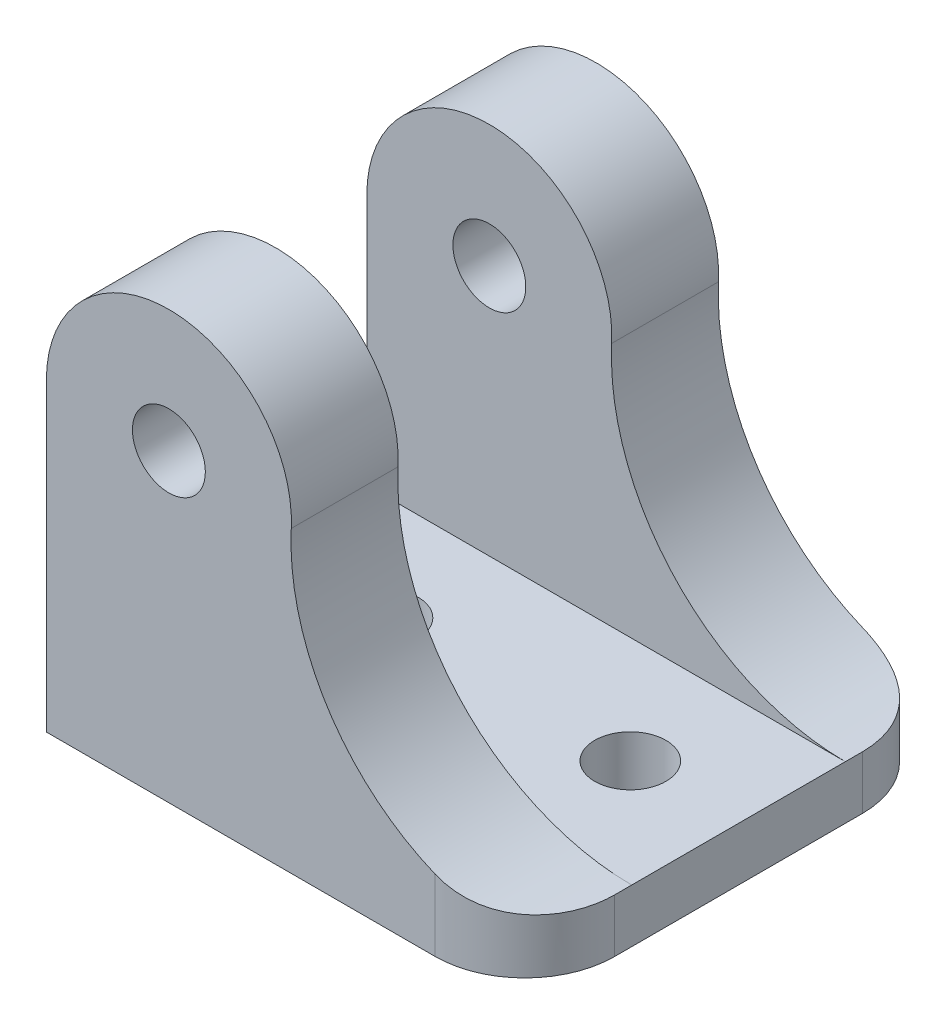
ISO-10303-21;
HEADER;
FILE_DESCRIPTION(('STEP AP214'),'2;1');
FILE_NAME('part.step','',(''),(''),'','','');
FILE_SCHEMA(('AUTOMOTIVE_DESIGN { 1 0 10303 214 1 1 1 1 }'));
ENDSEC;
DATA;
#1=APPLICATION_CONTEXT('core data for automotive mechanical design processes');
#2=APPLICATION_PROTOCOL_DEFINITION('international standard','automotive_design',2000,#1);
#3=PRODUCT_CONTEXT('',#1,'mechanical');
#4=PRODUCT('Part','Part','',(#3));
#5=PRODUCT_RELATED_PRODUCT_CATEGORY('part','',(#4));
#6=PRODUCT_DEFINITION_FORMATION('','',#4);
#7=PRODUCT_DEFINITION_CONTEXT('part definition',#1,'design');
#8=PRODUCT_DEFINITION('design','',#6,#7);
#9=PRODUCT_DEFINITION_SHAPE('','',#8);
#10=(LENGTH_UNIT() NAMED_UNIT(*) SI_UNIT(.MILLI.,.METRE.));
#11=(NAMED_UNIT(*) PLANE_ANGLE_UNIT() SI_UNIT($,.RADIAN.));
#12=(NAMED_UNIT(*) SI_UNIT($,.STERADIAN.) SOLID_ANGLE_UNIT());
#13=UNCERTAINTY_MEASURE_WITH_UNIT(LENGTH_MEASURE(1.E-05),#10,'distance_accuracy_value','');
#14=(GEOMETRIC_REPRESENTATION_CONTEXT(3) GLOBAL_UNCERTAINTY_ASSIGNED_CONTEXT((#13)) GLOBAL_UNIT_ASSIGNED_CONTEXT((#10,
#11,#12)) REPRESENTATION_CONTEXT('',''));
#15=CARTESIAN_POINT('',(0.,0.,0.));
#16=DIRECTION('',(0.,0.,1.));
#17=DIRECTION('',(1.,0.,0.));
#18=AXIS2_PLACEMENT_3D('',#15,#16,#17);
#19=CARTESIAN_POINT('',(-21.336,4.7625,19.05));
#20=DIRECTION('',(1.,0.,0.));
#21=DIRECTION('',(0.,0.,-1.));
#22=AXIS2_PLACEMENT_3D('',#19,#20,#21);
#23=PLANE('',#22);
#24=DIRECTION('',(0.,0.,1.));
#25=VECTOR('',#24,1.);
#26=CARTESIAN_POINT('',(-21.336,0.,19.05));
#27=LINE('',#26,#25);
#28=CARTESIAN_POINT('',(-21.336,0.,-19.05));
#29=VERTEX_POINT('',#28);
#30=CARTESIAN_POINT('',(-21.336,0.,19.05));
#31=VERTEX_POINT('',#30);
#32=EDGE_CURVE('E192',#29,#31,#27,.T.);
#33=ORIENTED_EDGE('',*,*,#32,.T.);
#34=DIRECTION('',(0.,-1.,0.));
#35=VECTOR('',#34,1.);
#36=CARTESIAN_POINT('',(-21.336,4.7625,19.05));
#37=LINE('',#36,#35);
#38=CARTESIAN_POINT('',(-21.336,27.178,19.05));
#39=VERTEX_POINT('',#38);
#40=EDGE_CURVE('E207',#39,#31,#37,.T.);
#41=ORIENTED_EDGE('',*,*,#40,.F.);
#42=DIRECTION('',(0.,0.,1.));
#43=VECTOR('',#42,1.);
#44=CARTESIAN_POINT('',(-21.336,27.178,9.525));
#45=LINE('',#44,#43);
#46=CARTESIAN_POINT('',(-21.336,27.178,9.525));
#47=VERTEX_POINT('',#46);
#48=EDGE_CURVE('E189',#47,#39,#45,.T.);
#49=ORIENTED_EDGE('',*,*,#48,.F.);
#50=DIRECTION('',(0.,-1.,0.));
#51=VECTOR('',#50,1.);
#52=CARTESIAN_POINT('',(-21.336,4.7625,9.525));
#53=LINE('',#52,#51);
#54=CARTESIAN_POINT('',(-21.336,4.7625,9.525));
#55=VERTEX_POINT('',#54);
#56=EDGE_CURVE('E128',#47,#55,#53,.T.);
#57=ORIENTED_EDGE('',*,*,#56,.T.);
#58=DIRECTION('',(0.,0.,1.));
#59=VECTOR('',#58,1.);
#60=CARTESIAN_POINT('',(-21.336,4.7625,19.05));
#61=LINE('',#60,#59);
#62=CARTESIAN_POINT('',(-21.336,4.7625,-9.525));
#63=VERTEX_POINT('',#62);
#64=EDGE_CURVE('E121',#63,#55,#61,.T.);
#65=ORIENTED_EDGE('',*,*,#64,.F.);
#66=DIRECTION('',(0.,-1.,0.));
#67=VECTOR('',#66,1.);
#68=CARTESIAN_POINT('',(-21.336,4.7625,-9.525));
#69=LINE('',#68,#67);
#70=CARTESIAN_POINT('',(-21.336,27.178,-9.525));
#71=VERTEX_POINT('',#70);
#72=EDGE_CURVE('E126',#71,#63,#69,.T.);
#73=ORIENTED_EDGE('',*,*,#72,.F.);
#74=DIRECTION('',(0.,0.,-1.));
#75=VECTOR('',#74,1.);
#76=CARTESIAN_POINT('',(-21.336,27.178,-9.525));
#77=LINE('',#76,#75);
#78=CARTESIAN_POINT('',(-21.336,27.178,-19.05));
#79=VERTEX_POINT('',#78);
#80=EDGE_CURVE('E155',#71,#79,#77,.T.);
#81=ORIENTED_EDGE('',*,*,#80,.T.);
#82=DIRECTION('',(0.,-1.,0.));
#83=VECTOR('',#82,1.);
#84=CARTESIAN_POINT('',(-21.336,4.7625,-19.05));
#85=LINE('',#84,#83);
#86=EDGE_CURVE('E197',#79,#29,#85,.T.);
#87=ORIENTED_EDGE('',*,*,#86,.T.);
#88=EDGE_LOOP('',(#33,#41,#49,#57,#65,#73,#81,#87));
#89=FACE_BOUND('',#88,.T.);
#90=ADVANCED_FACE('F35',(#89),#23,.F.);
#91=CARTESIAN_POINT('',(21.336,4.7625,19.05));
#92=DIRECTION('',(0.,0.,-1.));
#93=DIRECTION('',(-1.,0.,0.));
#94=AXIS2_PLACEMENT_3D('',#91,#92,#93);
#95=PLANE('',#94);
#96=DIRECTION('',(1.,0.,0.));
#97=VECTOR('',#96,1.);
#98=CARTESIAN_POINT('',(21.336,0.,19.05));
#99=LINE('',#98,#97);
#100=CARTESIAN_POINT('',(13.336,0.,19.05));
#101=VERTEX_POINT('',#100);
#102=EDGE_CURVE('E199',#31,#101,#99,.T.);
#103=ORIENTED_EDGE('',*,*,#102,.T.);
#104=DIRECTION('',(0.,-1.,0.));
#105=VECTOR('',#104,1.);
#106=CARTESIAN_POINT('',(13.336,4.7625,19.05));
#107=LINE('',#106,#105);
#108=CARTESIAN_POINT('',(13.336,6.35755295261252,19.05));
#109=VERTEX_POINT('',#108);
#110=EDGE_CURVE('E48',#101,#109,#107,.F.);
#111=ORIENTED_EDGE('',*,*,#110,.T.);
#112=CARTESIAN_POINT('',(21.336,25.6220563591309,19.05));
#113=DIRECTION('',(0.,0.,-1.));
#114=DIRECTION('',(1.,0.,0.));
#115=AXIS2_PLACEMENT_3D('',#112,#113,#114);
#116=CIRCLE('',#115,20.8595563591309);
#117=CARTESIAN_POINT('',(0.501451895639545,26.6431816143503,19.05));
#118=VERTEX_POINT('',#117);
#119=EDGE_CURVE('E172',#109,#118,#116,.T.);
#120=ORIENTED_EDGE('',*,*,#119,.T.);
#121=CARTESIAN_POINT('',(-10.4107249660736,27.178,19.05));
#122=DIRECTION('',(0.,0.,1.));
#123=DIRECTION('',(-1.,0.,0.));
#124=AXIS2_PLACEMENT_3D('',#121,#122,#123);
#125=CIRCLE('',#124,10.9252750339264);
#126=EDGE_CURVE('E178',#118,#39,#125,.T.);
#127=ORIENTED_EDGE('',*,*,#126,.T.);
#128=ORIENTED_EDGE('',*,*,#40,.T.);
#129=EDGE_LOOP('',(#103,#111,#120,#127,#128));
#130=FACE_BOUND('',#129,.T.);
#131=CARTESIAN_POINT('',(-10.4107249660736,27.178,19.05));
#132=DIRECTION('',(0.,0.,1.));
#133=DIRECTION('',(1.,0.,0.));
#134=AXIS2_PLACEMENT_3D('',#131,#132,#133);
#135=CIRCLE('',#134,3.25);
#136=CARTESIAN_POINT('',(-7.16072496607357,27.178,19.05));
#137=VERTEX_POINT('',#136);
#138=EDGE_CURVE('E164',#137,#137,#135,.T.);
#139=ORIENTED_EDGE('',*,*,#138,.F.);
#140=EDGE_LOOP('',(#139));
#141=FACE_BOUND('',#140,.T.);
#142=ADVANCED_FACE('F279',(#130,#141),#95,.F.);
#143=CARTESIAN_POINT('',(21.336,4.7625,19.05));
#144=DIRECTION('',(-1.,0.,0.));
#145=DIRECTION('',(0.,0.,1.));
#146=AXIS2_PLACEMENT_3D('',#143,#144,#145);
#147=PLANE('',#146);
#148=DIRECTION('',(0.,0.,-1.));
#149=VECTOR('',#148,1.);
#150=CARTESIAN_POINT('',(21.336,0.,19.05));
#151=LINE('',#150,#149);
#152=CARTESIAN_POINT('',(21.336,0.,11.05));
#153=VERTEX_POINT('',#152);
#154=CARTESIAN_POINT('',(21.336,0.,-11.05));
#155=VERTEX_POINT('',#154);
#156=EDGE_CURVE('E201',#153,#155,#151,.T.);
#157=ORIENTED_EDGE('',*,*,#156,.T.);
#158=DIRECTION('',(0.,-1.,0.));
#159=VECTOR('',#158,1.);
#160=CARTESIAN_POINT('',(21.336,4.7625,-11.05));
#161=LINE('',#160,#159);
#162=CARTESIAN_POINT('',(21.336,4.7625,-11.05));
#163=VERTEX_POINT('',#162);
#164=EDGE_CURVE('E228',#155,#163,#161,.F.);
#165=ORIENTED_EDGE('',*,*,#164,.T.);
#166=DIRECTION('',(0.,0.,-1.));
#167=VECTOR('',#166,1.);
#168=CARTESIAN_POINT('',(21.336,4.7625,-9.525));
#169=LINE('',#168,#167);
#170=CARTESIAN_POINT('',(21.336,4.7625,-9.52499999999999));
#171=VERTEX_POINT('',#170);
#172=EDGE_CURVE('E161',#171,#163,#169,.T.);
#173=ORIENTED_EDGE('',*,*,#172,.F.);
#174=DIRECTION('',(0.,0.,-1.));
#175=VECTOR('',#174,1.);
#176=CARTESIAN_POINT('',(21.336,4.7625,19.05));
#177=LINE('',#176,#175);
#178=CARTESIAN_POINT('',(21.336,4.7625,9.525));
#179=VERTEX_POINT('',#178);
#180=EDGE_CURVE('E132',#179,#171,#177,.T.);
#181=ORIENTED_EDGE('',*,*,#180,.F.);
#182=CARTESIAN_POINT('',(21.336,4.7625,11.05));
#183=VERTEX_POINT('',#182);
#184=EDGE_CURVE('E195',#183,#179,#177,.T.);
#185=ORIENTED_EDGE('',*,*,#184,.F.);
#186=DIRECTION('',(0.,-1.,0.));
#187=VECTOR('',#186,1.);
#188=CARTESIAN_POINT('',(21.336,4.7625,11.05));
#189=LINE('',#188,#187);
#190=EDGE_CURVE('E225',#183,#153,#189,.T.);
#191=ORIENTED_EDGE('',*,*,#190,.T.);
#192=EDGE_LOOP('',(#157,#165,#173,#181,#185,#191));
#193=FACE_BOUND('',#192,.T.);
#194=ADVANCED_FACE('F275',(#193),#147,.F.);
#195=CARTESIAN_POINT('',(21.336,4.7625,-19.05));
#196=DIRECTION('',(0.,0.,1.));
#197=DIRECTION('',(1.,0.,0.));
#198=AXIS2_PLACEMENT_3D('',#195,#196,#197);
#199=PLANE('',#198);
#200=CARTESIAN_POINT('',(21.336,25.6220563591309,-19.05));
#201=DIRECTION('',(0.,0.,-1.));
#202=DIRECTION('',(1.,0.,0.));
#203=AXIS2_PLACEMENT_3D('',#200,#201,#202);
#204=CIRCLE('',#203,20.8595563591309);
#205=CARTESIAN_POINT('',(13.336,6.35755295261252,-19.05));
#206=VERTEX_POINT('',#205);
#207=CARTESIAN_POINT('',(0.501451895639545,26.6431816143503,-19.05));
#208=VERTEX_POINT('',#207);
#209=EDGE_CURVE('E142',#206,#208,#204,.T.);
#210=ORIENTED_EDGE('',*,*,#209,.F.);
#211=DIRECTION('',(0.,-1.,0.));
#212=VECTOR('',#211,1.);
#213=CARTESIAN_POINT('',(13.336,4.7625,-19.05));
#214=LINE('',#213,#212);
#215=CARTESIAN_POINT('',(13.336,0.,-19.05));
#216=VERTEX_POINT('',#215);
#217=EDGE_CURVE('E210',#206,#216,#214,.T.);
#218=ORIENTED_EDGE('',*,*,#217,.T.);
#219=DIRECTION('',(-1.,0.,0.));
#220=VECTOR('',#219,1.);
#221=CARTESIAN_POINT('',(21.336,0.,-19.05));
#222=LINE('',#221,#220);
#223=EDGE_CURVE('E133',#216,#29,#222,.T.);
#224=ORIENTED_EDGE('',*,*,#223,.T.);
#225=ORIENTED_EDGE('',*,*,#86,.F.);
#226=CARTESIAN_POINT('',(-10.4107249660736,27.178,-19.05));
#227=DIRECTION('',(0.,0.,1.));
#228=DIRECTION('',(-1.,0.,0.));
#229=AXIS2_PLACEMENT_3D('',#226,#227,#228);
#230=CIRCLE('',#229,10.9252750339264);
#231=EDGE_CURVE('E156',#208,#79,#230,.T.);
#232=ORIENTED_EDGE('',*,*,#231,.F.);
#233=EDGE_LOOP('',(#210,#218,#224,#225,#232));
#234=FACE_BOUND('',#233,.T.);
#235=CARTESIAN_POINT('',(-10.4107249660736,27.178,-19.05));
#236=DIRECTION('',(0.,0.,1.));
#237=DIRECTION('',(1.,0.,0.));
#238=AXIS2_PLACEMENT_3D('',#235,#236,#237);
#239=CIRCLE('',#238,3.25);
#240=CARTESIAN_POINT('',(-13.6607249660736,27.178,-19.05));
#241=VERTEX_POINT('',#240);
#242=EDGE_CURVE('E218',#241,#241,#239,.T.);
#243=ORIENTED_EDGE('',*,*,#242,.T.);
#244=EDGE_LOOP('',(#243));
#245=FACE_BOUND('',#244,.T.);
#246=ADVANCED_FACE('F268',(#234,#245),#199,.F.);
#247=CARTESIAN_POINT('',(0.,4.7625,0.));
#248=DIRECTION('',(0.,1.,0.));
#249=DIRECTION('',(0.,0.,1.));
#250=AXIS2_PLACEMENT_3D('',#247,#248,#249);
#251=PLANE('',#250);
#252=CARTESIAN_POINT('',(-10.414,4.7625,0.));
#253=DIRECTION('',(0.,1.,0.));
#254=DIRECTION('',(0.,0.,1.));
#255=AXIS2_PLACEMENT_3D('',#252,#253,#254);
#256=CIRCLE('',#255,3.175);
#257=CARTESIAN_POINT('',(-10.414,4.7625,3.175));
#258=VERTEX_POINT('',#257);
#259=EDGE_CURVE('E215',#258,#258,#256,.T.);
#260=ORIENTED_EDGE('',*,*,#259,.F.);
#261=EDGE_LOOP('',(#260));
#262=FACE_BOUND('',#261,.T.);
#263=CARTESIAN_POINT('',(11.684,4.7625,0.));
#264=DIRECTION('',(0.,1.,0.));
#265=DIRECTION('',(0.,0.,1.));
#266=AXIS2_PLACEMENT_3D('',#263,#264,#265);
#267=CIRCLE('',#266,3.175);
#268=CARTESIAN_POINT('',(11.684,4.7625,3.175));
#269=VERTEX_POINT('',#268);
#270=EDGE_CURVE('E443',#269,#269,#267,.T.);
#271=ORIENTED_EDGE('',*,*,#270,.F.);
#272=EDGE_LOOP('',(#271));
#273=FACE_BOUND('',#272,.T.);
#274=DIRECTION('',(1.,0.,0.));
#275=VECTOR('',#274,1.);
#276=CARTESIAN_POINT('',(21.336,4.7625,-9.525));
#277=LINE('',#276,#275);
#278=EDGE_CURVE('E137',#63,#171,#277,.T.);
#279=ORIENTED_EDGE('',*,*,#278,.F.);
#280=ORIENTED_EDGE('',*,*,#64,.T.);
#281=DIRECTION('',(1.,0.,0.));
#282=VECTOR('',#281,1.);
#283=CARTESIAN_POINT('',(21.336,4.7625,9.525));
#284=LINE('',#283,#282);
#285=EDGE_CURVE('E175',#55,#179,#284,.T.);
#286=ORIENTED_EDGE('',*,*,#285,.T.);
#287=ORIENTED_EDGE('',*,*,#180,.T.);
#288=EDGE_LOOP('',(#279,#280,#286,#287));
#289=FACE_BOUND('',#288,.T.);
#290=ADVANCED_FACE('F138',(#262,#273,#289),#251,.T.);
#291=CARTESIAN_POINT('',(0.,0.,0.));
#292=DIRECTION('',(0.,1.,0.));
#293=DIRECTION('',(0.,0.,1.));
#294=AXIS2_PLACEMENT_3D('',#291,#292,#293);
#295=PLANE('',#294);
#296=CARTESIAN_POINT('',(-10.414,0.,0.));
#297=DIRECTION('',(0.,1.,0.));
#298=DIRECTION('',(0.,0.,1.));
#299=AXIS2_PLACEMENT_3D('',#296,#297,#298);
#300=CIRCLE('',#299,3.175);
#301=CARTESIAN_POINT('',(-10.414,0.,3.175));
#302=VERTEX_POINT('',#301);
#303=EDGE_CURVE('E214',#302,#302,#300,.T.);
#304=ORIENTED_EDGE('',*,*,#303,.T.);
#305=EDGE_LOOP('',(#304));
#306=FACE_BOUND('',#305,.T.);
#307=CARTESIAN_POINT('',(11.684,0.,0.));
#308=DIRECTION('',(0.,1.,0.));
#309=DIRECTION('',(0.,0.,1.));
#310=AXIS2_PLACEMENT_3D('',#307,#308,#309);
#311=CIRCLE('',#310,3.175);
#312=CARTESIAN_POINT('',(11.684,0.,3.175));
#313=VERTEX_POINT('',#312);
#314=EDGE_CURVE('E211',#313,#313,#311,.T.);
#315=ORIENTED_EDGE('',*,*,#314,.T.);
#316=EDGE_LOOP('',(#315));
#317=FACE_BOUND('',#316,.T.);
#318=ORIENTED_EDGE('',*,*,#223,.F.);
#319=CARTESIAN_POINT('',(13.336,0.,-11.05));
#320=DIRECTION('',(0.,1.,0.));
#321=DIRECTION('',(0.,0.,1.));
#322=AXIS2_PLACEMENT_3D('',#319,#320,#321);
#323=CIRCLE('',#322,8.);
#324=EDGE_CURVE('E223',#216,#155,#323,.F.);
#325=ORIENTED_EDGE('',*,*,#324,.T.);
#326=ORIENTED_EDGE('',*,*,#156,.F.);
#327=CARTESIAN_POINT('',(13.336,0.,11.05));
#328=DIRECTION('',(0.,1.,0.));
#329=DIRECTION('',(0.,0.,1.));
#330=AXIS2_PLACEMENT_3D('',#327,#328,#329);
#331=CIRCLE('',#330,8.);
#332=EDGE_CURVE('E221',#153,#101,#331,.F.);
#333=ORIENTED_EDGE('',*,*,#332,.T.);
#334=ORIENTED_EDGE('',*,*,#102,.F.);
#335=ORIENTED_EDGE('',*,*,#32,.F.);
#336=EDGE_LOOP('',(#318,#325,#326,#333,#334,#335));
#337=FACE_BOUND('',#336,.T.);
#338=ADVANCED_FACE('F261',(#306,#317,#337),#295,.F.);
#339=CARTESIAN_POINT('',(-10.4107249660736,27.178,9.525));
#340=DIRECTION('',(0.,0.,1.));
#341=DIRECTION('',(1.,0.,0.));
#342=AXIS2_PLACEMENT_3D('',#339,#340,#341);
#343=CYLINDRICAL_SURFACE('',#342,10.9252750339264);
#344=ORIENTED_EDGE('',*,*,#126,.F.);
#345=DIRECTION('',(0.,0.,1.));
#346=VECTOR('',#345,1.);
#347=CARTESIAN_POINT('',(0.501451895639545,26.6431816143503,9.525));
#348=LINE('',#347,#346);
#349=CARTESIAN_POINT('',(0.501451895639545,26.6431816143503,9.525));
#350=VERTEX_POINT('',#349);
#351=EDGE_CURVE('E185',#350,#118,#348,.T.);
#352=ORIENTED_EDGE('',*,*,#351,.F.);
#353=CARTESIAN_POINT('',(-10.4107249660736,27.178,9.525));
#354=DIRECTION('',(0.,0.,1.));
#355=DIRECTION('',(-1.,0.,0.));
#356=AXIS2_PLACEMENT_3D('',#353,#354,#355);
#357=CIRCLE('',#356,10.9252750339264);
#358=EDGE_CURVE('E181',#350,#47,#357,.T.);
#359=ORIENTED_EDGE('',*,*,#358,.T.);
#360=ORIENTED_EDGE('',*,*,#48,.T.);
#361=EDGE_LOOP('',(#344,#352,#359,#360));
#362=FACE_BOUND('',#361,.T.);
#363=ADVANCED_FACE('F259',(#362),#343,.T.);
#364=CARTESIAN_POINT('',(21.336,25.6220563591309,9.525));
#365=DIRECTION('',(0.,0.,1.));
#366=DIRECTION('',(1.,0.,0.));
#367=AXIS2_PLACEMENT_3D('',#364,#365,#366);
#368=CYLINDRICAL_SURFACE('',#367,20.8595563591309);
#369=ORIENTED_EDGE('',*,*,#119,.F.);
#370=CARTESIAN_POINT('',(13.336,6.35755295261252,19.05));
#371=CARTESIAN_POINT('',(13.5423837932101,6.271813934665,19.0500254607521));
#372=CARTESIAN_POINT('',(13.750208150584,6.18943190038139,19.0420135201743));
#373=CARTESIAN_POINT('',(14.1673218421514,6.03173909704851,19.0094332791549));
#374=CARTESIAN_POINT('',(14.3766117061092,5.95643104380982,18.9848586494009));
#375=CARTESIAN_POINT('',(14.7951656679795,5.81328041073305,18.9186571968772));
#376=CARTESIAN_POINT('',(15.0044297203946,5.74544089492221,18.8770234082816));
#377=CARTESIAN_POINT('',(15.4211281842727,5.61748550680439,18.7764586154615));
#378=CARTESIAN_POINT('',(15.6285628628243,5.55736848902538,18.7175301808072));
#379=CARTESIAN_POINT('',(16.0404381926426,5.44474650766165,18.5821402369452));
#380=CARTESIAN_POINT('',(16.2448688750361,5.39226325128238,18.5056302656631));
#381=CARTESIAN_POINT('',(16.6483093118055,5.29498802592071,18.3353650185133));
#382=CARTESIAN_POINT('',(16.8473191078032,5.25019599787088,18.2416098750974));
#383=CARTESIAN_POINT('',(17.2379236815931,5.16804298051031,18.0373827331896));
#384=CARTESIAN_POINT('',(17.4295251480166,5.13067515579599,17.9269262780492));
#385=CARTESIAN_POINT('',(17.8037617828337,5.06286005282564,17.6898916199587));
#386=CARTESIAN_POINT('',(17.986397305026,5.03241250132122,17.5633140538621));
#387=CARTESIAN_POINT('',(18.3345823234009,4.97883773494165,17.2998069577914));
#388=CARTESIAN_POINT('',(18.5005125332097,4.95548335971661,17.1634259540624));
#389=CARTESIAN_POINT('',(18.82127137775,4.91400484291241,16.8773488388363));
#390=CARTESIAN_POINT('',(18.976096212039,4.89588248545861,16.7276482080387));
#391=CARTESIAN_POINT('',(19.2733869905294,4.86418858770387,16.415987185025));
#392=CARTESIAN_POINT('',(19.4158523726091,4.85061725430827,16.2540262358225));
#393=CARTESIAN_POINT('',(19.6874167767851,4.82730095294412,15.918885326699));
#394=CARTESIAN_POINT('',(19.8165096687752,4.81755773416243,15.7457002801386));
#395=CARTESIAN_POINT('',(20.061897685071,4.80107950612152,15.3870630034903));
#396=CARTESIAN_POINT('',(20.1780066233132,4.79438484581244,15.2014815339676));
#397=CARTESIAN_POINT('',(20.3946067229712,4.78347124101492,14.8214565956272));
#398=CARTESIAN_POINT('',(20.4951045410425,4.77925123917843,14.6270169499718));
#399=CARTESIAN_POINT('',(20.6798589675252,4.77261702350041,14.2305010464378));
#400=CARTESIAN_POINT('',(20.7641126667768,4.7702031328928,14.0284234284107));
#401=CARTESIAN_POINT('',(20.9157503622311,4.76659571563108,13.6181112840237));
#402=CARTESIAN_POINT('',(20.983141387984,4.76540167981346,13.4098793638237));
#403=CARTESIAN_POINT('',(21.0906245551586,4.7638865065078,13.0245167692437));
#404=CARTESIAN_POINT('',(21.1334116021181,4.76345130249446,12.8481322586605));
#405=CARTESIAN_POINT('',(21.2068957371093,4.76286729886122,12.4928776340202));
#406=CARTESIAN_POINT('',(21.2375942867717,4.76271846460764,12.3140078231721));
#407=CARTESIAN_POINT('',(21.2867448007278,4.7625428527624,11.9547119560528));
#408=CARTESIAN_POINT('',(21.3052045948597,4.76251599706954,11.7742869697163));
#409=CARTESIAN_POINT('',(21.3298380409232,4.76250037275881,11.4125754045143));
#410=CARTESIAN_POINT('',(21.3360099989973,4.76251160939132,11.2312887103159));
#411=CARTESIAN_POINT('',(21.336,4.7625,11.05));
#412=B_SPLINE_CURVE_WITH_KNOTS('',3,(#370,#371,#372,#373,#374,#375,#376,#377,#378,#379,#380,
#381,#382,#383,#384,#385,#386,#387,#388,#389,#390,#391,#392,#393,#394,#395,#396,#397,#398,#399,
#400,#401,#402,#403,#404,#405,#406,#407,#408,#409,#410,#411),.UNSPECIFIED.,.F.,.F.,(4,2,2,2,2,2,
2,2,2,2,2,2,2,2,2,2,2,2,2,2,4),(0.,0.670344144283213,1.34094460111138,2.01181915988868,
2.68259409318623,3.35524062505543,4.02788199087395,4.69990116178776,5.37189379327673,
6.01928854441556,6.66690379801623,7.31454849046154,7.96248876908629,8.61877190739101,
9.27477443070934,9.93089432863044,10.5867402521631,11.1308372575724,11.6748684555221,
12.2185512685962,12.7623090222354),.UNSPECIFIED.);
#413=EDGE_CURVE('E11',#109,#183,#412,.T.);
#414=ORIENTED_EDGE('',*,*,#413,.T.);
#415=ORIENTED_EDGE('',*,*,#184,.T.);
#416=CARTESIAN_POINT('',(21.336,25.6220563591309,9.525));
#417=DIRECTION('',(0.,0.,-1.));
#418=DIRECTION('',(1.,0.,0.));
#419=AXIS2_PLACEMENT_3D('',#416,#417,#418);
#420=CIRCLE('',#419,20.8595563591309);
#421=EDGE_CURVE('E177',#179,#350,#420,.T.);
#422=ORIENTED_EDGE('',*,*,#421,.T.);
#423=ORIENTED_EDGE('',*,*,#351,.T.);
#424=EDGE_LOOP('',(#369,#414,#415,#422,#423));
#425=FACE_BOUND('',#424,.T.);
#426=ADVANCED_FACE('F257',(#425),#368,.F.);
#427=CARTESIAN_POINT('',(-10.4107249660736,27.178,9.525));
#428=DIRECTION('',(0.,0.,-1.));
#429=DIRECTION('',(-1.,0.,0.));
#430=AXIS2_PLACEMENT_3D('',#427,#428,#429);
#431=PLANE('',#430);
#432=CARTESIAN_POINT('',(-10.4107249660736,27.178,9.525));
#433=DIRECTION('',(0.,0.,1.));
#434=DIRECTION('',(1.,0.,0.));
#435=AXIS2_PLACEMENT_3D('',#432,#433,#434);
#436=CIRCLE('',#435,3.25);
#437=CARTESIAN_POINT('',(-7.16072496607357,27.178,9.525));
#438=VERTEX_POINT('',#437);
#439=EDGE_CURVE('E169',#438,#438,#436,.T.);
#440=ORIENTED_EDGE('',*,*,#439,.T.);
#441=EDGE_LOOP('',(#440));
#442=FACE_BOUND('',#441,.T.);
#443=ORIENTED_EDGE('',*,*,#285,.F.);
#444=ORIENTED_EDGE('',*,*,#56,.F.);
#445=ORIENTED_EDGE('',*,*,#358,.F.);
#446=ORIENTED_EDGE('',*,*,#421,.F.);
#447=EDGE_LOOP('',(#443,#444,#445,#446));
#448=FACE_BOUND('',#447,.T.);
#449=ADVANCED_FACE('F253',(#442,#448),#431,.T.);
#450=CARTESIAN_POINT('',(-10.4107249660736,27.178,9.525));
#451=DIRECTION('',(0.,0.,1.));
#452=DIRECTION('',(1.,0.,0.));
#453=AXIS2_PLACEMENT_3D('',#450,#451,#452);
#454=CYLINDRICAL_SURFACE('',#453,3.25);
#455=CARTESIAN_POINT('',(-7.16072496607357,27.178,9.525));
#456=CARTESIAN_POINT('',(-7.16072496607357,27.178,9.62421875));
#457=CARTESIAN_POINT('',(-7.16072496607357,27.178,9.7234375));
#458=CARTESIAN_POINT('',(-7.16072496607357,27.178,9.92187499999999));
#459=CARTESIAN_POINT('',(-7.16072496607357,27.178,10.02109375));
#460=CARTESIAN_POINT('',(-7.16072496607357,27.178,10.21953125));
#461=CARTESIAN_POINT('',(-7.16072496607357,27.178,10.31875));
#462=CARTESIAN_POINT('',(-7.16072496607357,27.178,10.5171875));
#463=CARTESIAN_POINT('',(-7.16072496607357,27.178,10.61640625));
#464=CARTESIAN_POINT('',(-7.16072496607357,27.178,10.81484375));
#465=CARTESIAN_POINT('',(-7.16072496607357,27.178,10.9140625));
#466=CARTESIAN_POINT('',(-7.16072496607357,27.178,11.1125));
#467=CARTESIAN_POINT('',(-7.16072496607357,27.178,11.21171875));
#468=CARTESIAN_POINT('',(-7.16072496607357,27.178,11.41015625));
#469=CARTESIAN_POINT('',(-7.16072496607357,27.178,11.509375));
#470=CARTESIAN_POINT('',(-7.16072496607357,27.178,11.7078125));
#471=CARTESIAN_POINT('',(-7.16072496607357,27.178,11.80703125));
#472=CARTESIAN_POINT('',(-7.16072496607357,27.178,12.00546875));
#473=CARTESIAN_POINT('',(-7.16072496607357,27.178,12.1046875));
#474=CARTESIAN_POINT('',(-7.16072496607357,27.178,12.303125));
#475=CARTESIAN_POINT('',(-7.16072496607357,27.178,12.40234375));
#476=CARTESIAN_POINT('',(-7.16072496607357,27.178,12.60078125));
#477=CARTESIAN_POINT('',(-7.16072496607357,27.178,12.7));
#478=CARTESIAN_POINT('',(-7.16072496607357,27.178,12.8984375));
#479=CARTESIAN_POINT('',(-7.16072496607357,27.178,12.99765625));
#480=CARTESIAN_POINT('',(-7.16072496607357,27.178,13.19609375));
#481=CARTESIAN_POINT('',(-7.16072496607357,27.178,13.2953125));
#482=CARTESIAN_POINT('',(-7.16072496607357,27.178,13.49375));
#483=CARTESIAN_POINT('',(-7.16072496607357,27.178,13.59296875));
#484=CARTESIAN_POINT('',(-7.16072496607357,27.178,13.79140625));
#485=CARTESIAN_POINT('',(-7.16072496607357,27.178,13.890625));
#486=CARTESIAN_POINT('',(-7.16072496607357,27.178,14.0890625));
#487=CARTESIAN_POINT('',(-7.16072496607357,27.178,14.18828125));
#488=CARTESIAN_POINT('',(-7.16072496607357,27.178,14.38671875));
#489=CARTESIAN_POINT('',(-7.16072496607357,27.178,14.4859375));
#490=CARTESIAN_POINT('',(-7.16072496607357,27.178,14.684375));
#491=CARTESIAN_POINT('',(-7.16072496607357,27.178,14.78359375));
#492=CARTESIAN_POINT('',(-7.16072496607357,27.178,14.98203125));
#493=CARTESIAN_POINT('',(-7.16072496607357,27.178,15.08125));
#494=CARTESIAN_POINT('',(-7.16072496607357,27.178,15.2796875));
#495=CARTESIAN_POINT('',(-7.16072496607357,27.178,15.37890625));
#496=CARTESIAN_POINT('',(-7.16072496607357,27.178,15.57734375));
#497=CARTESIAN_POINT('',(-7.16072496607357,27.178,15.6765625));
#498=CARTESIAN_POINT('',(-7.16072496607357,27.178,15.875));
#499=CARTESIAN_POINT('',(-7.16072496607357,27.178,15.97421875));
#500=CARTESIAN_POINT('',(-7.16072496607357,27.178,16.17265625));
#501=CARTESIAN_POINT('',(-7.16072496607357,27.178,16.271875));
#502=CARTESIAN_POINT('',(-7.16072496607357,27.178,16.4703125));
#503=CARTESIAN_POINT('',(-7.16072496607357,27.178,16.56953125));
#504=CARTESIAN_POINT('',(-7.16072496607357,27.178,16.76796875));
#505=CARTESIAN_POINT('',(-7.16072496607357,27.178,16.8671875));
#506=CARTESIAN_POINT('',(-7.16072496607357,27.178,17.065625));
#507=CARTESIAN_POINT('',(-7.16072496607357,27.178,17.16484375));
#508=CARTESIAN_POINT('',(-7.16072496607357,27.178,17.36328125));
#509=CARTESIAN_POINT('',(-7.16072496607357,27.178,17.4625));
#510=CARTESIAN_POINT('',(-7.16072496607357,27.178,17.6609375));
#511=CARTESIAN_POINT('',(-7.16072496607357,27.178,17.76015625));
#512=CARTESIAN_POINT('',(-7.16072496607357,27.178,17.95859375));
#513=CARTESIAN_POINT('',(-7.16072496607357,27.178,18.0578125));
#514=CARTESIAN_POINT('',(-7.16072496607357,27.178,18.25625));
#515=CARTESIAN_POINT('',(-7.16072496607357,27.178,18.35546875));
#516=CARTESIAN_POINT('',(-7.16072496607357,27.178,18.55390625));
#517=CARTESIAN_POINT('',(-7.16072496607357,27.178,18.653125));
#518=CARTESIAN_POINT('',(-7.16072496607357,27.178,18.8515625));
#519=CARTESIAN_POINT('',(-7.16072496607357,27.178,18.95078125));
#520=CARTESIAN_POINT('',(-7.16072496607357,27.178,19.05));
#521=B_SPLINE_CURVE_WITH_KNOTS('',3,(#455,#456,#457,#458,#459,#460,#461,#462,#463,#464,#465,
#466,#467,#468,#469,#470,#471,#472,#473,#474,#475,#476,#477,#478,#479,#480,#481,#482,#483,#484,
#485,#486,#487,#488,#489,#490,#491,#492,#493,#494,#495,#496,#497,#498,#499,#500,#501,#502,#503,
#504,#505,#506,#507,#508,#509,#510,#511,#512,#513,#514,#515,#516,#517,#518,#519,#520),
.UNSPECIFIED.,.F.,.F.,(4,2,2,2,2,2,2,2,2,2,2,2,2,2,2,2,2,2,2,2,2,2,2,2,2,2,2,2,2,2,2,2,4),(0.,
0.29765625,0.5953125,0.892968750000001,1.190625,1.48828125,1.7859375,2.08359375,2.38125,
2.67890625,2.9765625,3.27421875,3.571875,3.86953125,4.1671875,4.46484375,4.7625,5.06015625,
5.3578125,5.65546875,5.953125,6.25078125,6.5484375,6.84609375,7.14375,7.44140625,7.7390625,
8.03671875,8.334375,8.63203125,8.9296875,9.22734375,9.525),.UNSPECIFIED.);
#522=EDGE_CURVE('BSEAM250',#438,#137,#521,.T.);
#523=ORIENTED_EDGE('',*,*,#439,.F.);
#524=ORIENTED_EDGE('',*,*,#138,.T.);
#525=ORIENTED_EDGE('',*,*,#522,.T.);
#526=ORIENTED_EDGE('',*,*,#522,.F.);
#527=EDGE_LOOP('',(#523,#525,#524,#526));
#528=FACE_BOUND('',#527,.T.);
#529=ADVANCED_FACE('F250',(#528),#454,.F.);
#530=CARTESIAN_POINT('',(-10.4107249660736,27.178,-9.525));
#531=DIRECTION('',(0.,0.,1.));
#532=DIRECTION('',(-1.,0.,0.));
#533=AXIS2_PLACEMENT_3D('',#530,#531,#532);
#534=PLANE('',#533);
#535=ORIENTED_EDGE('',*,*,#278,.T.);
#536=CARTESIAN_POINT('',(21.336,25.6220563591309,-9.525));
#537=DIRECTION('',(0.,0.,-1.));
#538=DIRECTION('',(1.,0.,0.));
#539=AXIS2_PLACEMENT_3D('',#536,#537,#538);
#540=CIRCLE('',#539,20.8595563591309);
#541=CARTESIAN_POINT('',(0.501451895639545,26.6431816143503,-9.525));
#542=VERTEX_POINT('',#541);
#543=EDGE_CURVE('E150',#171,#542,#540,.T.);
#544=ORIENTED_EDGE('',*,*,#543,.T.);
#545=CARTESIAN_POINT('',(-10.4107249660736,27.178,-9.525));
#546=DIRECTION('',(0.,0.,1.));
#547=DIRECTION('',(-1.,0.,0.));
#548=AXIS2_PLACEMENT_3D('',#545,#546,#547);
#549=CIRCLE('',#548,10.9252750339264);
#550=EDGE_CURVE('E147',#542,#71,#549,.T.);
#551=ORIENTED_EDGE('',*,*,#550,.T.);
#552=ORIENTED_EDGE('',*,*,#72,.T.);
#553=EDGE_LOOP('',(#535,#544,#551,#552));
#554=FACE_BOUND('',#553,.T.);
#555=CARTESIAN_POINT('',(-10.4107249660736,27.178,-9.525));
#556=DIRECTION('',(0.,0.,1.));
#557=DIRECTION('',(1.,0.,0.));
#558=AXIS2_PLACEMENT_3D('',#555,#556,#557);
#559=CIRCLE('',#558,3.25);
#560=CARTESIAN_POINT('',(-13.6607249660736,27.178,-9.525));
#561=VERTEX_POINT('',#560);
#562=EDGE_CURVE('E159',#561,#561,#559,.T.);
#563=ORIENTED_EDGE('',*,*,#562,.F.);
#564=EDGE_LOOP('',(#563));
#565=FACE_BOUND('',#564,.T.);
#566=ADVANCED_FACE('F144',(#554,#565),#534,.T.);
#567=CARTESIAN_POINT('',(21.336,25.6220563591309,-9.525));
#568=DIRECTION('',(0.,0.,-1.));
#569=DIRECTION('',(-1.,0.,0.));
#570=AXIS2_PLACEMENT_3D('',#567,#568,#569);
#571=CYLINDRICAL_SURFACE('',#570,20.8595563591309);
#572=ORIENTED_EDGE('',*,*,#172,.T.);
#573=CARTESIAN_POINT('',(21.336,4.7625,-11.05));
#574=CARTESIAN_POINT('',(21.3360240539328,4.76252727061968,-11.2746804343434));
#575=CARTESIAN_POINT('',(21.3265357638714,4.76250085670853,-11.4993574388032));
#576=CARTESIAN_POINT('',(21.2887081216378,4.76253774878584,-11.947109945098));
#577=CARTESIAN_POINT('',(21.2603695571863,4.76260105102534,-12.1701855134605));
#578=CARTESIAN_POINT('',(21.1850335966229,4.76301433149412,-12.6130500208217));
#579=CARTESIAN_POINT('',(21.1380454342622,4.76336416794619,-12.8328405305146));
#580=CARTESIAN_POINT('',(21.0257518425595,4.76473129067594,-13.2676865765114));
#581=CARTESIAN_POINT('',(20.9604466389819,4.76574856872737,-13.4827421711396));
#582=CARTESIAN_POINT('',(20.8119390296236,4.76895202177245,-13.9067145758319));
#583=CARTESIAN_POINT('',(20.728726280727,4.7711388733821,-14.1156277585377));
#584=CARTESIAN_POINT('',(20.5450265209788,4.77729935958553,-14.5256882495681));
#585=CARTESIAN_POINT('',(20.4445396678248,4.78127297786822,-14.7268356287671));
#586=CARTESIAN_POINT('',(20.2270413103817,4.79171436876121,-15.1198883520994));
#587=CARTESIAN_POINT('',(20.1100320260226,4.79818180650723,-15.3117949331754));
#588=CARTESIAN_POINT('',(19.8603573586268,4.81438438650867,-15.6849932386479));
#589=CARTESIAN_POINT('',(19.7276921695895,4.8241194882757,-15.8662850945347));
#590=CARTESIAN_POINT('',(19.44858311756,4.84759522899247,-16.2158540252707));
#591=CARTESIAN_POINT('',(19.3022277879334,4.86131119329017,-16.3842034263294));
#592=CARTESIAN_POINT('',(18.9962277012659,4.89356829016739,-16.7078633837691));
#593=CARTESIAN_POINT('',(18.8365829481164,4.91210942133403,-16.863173943968));
#594=CARTESIAN_POINT('',(18.5053847193109,4.95477379357757,-17.1595686089574));
#595=CARTESIAN_POINT('',(18.3338355395642,4.9788950282396,-17.3006578011493));
#596=CARTESIAN_POINT('',(17.9802538711414,5.03341759664942,-17.5676667481493));
#597=CARTESIAN_POINT('',(17.7982217312192,5.06381872156069,-17.6935870071769));
#598=CARTESIAN_POINT('',(17.4299069958986,5.13065126148631,-17.9264977161765));
#599=CARTESIAN_POINT('',(17.2438414617783,5.16691460174783,-18.033879885952));
#600=CARTESIAN_POINT('',(16.8648588105121,5.24639768629196,-18.2328236494542));
#601=CARTESIAN_POINT('',(16.6719415758515,5.28961754993211,-18.3243849716765));
#602=CARTESIAN_POINT('',(16.2808381851495,5.38330928533498,-18.4913143187388));
#603=CARTESIAN_POINT('',(16.0826498395106,5.43378421041015,-18.5666754922095));
#604=CARTESIAN_POINT('',(15.6827721878097,5.54209136081213,-18.7009562297946));
#605=CARTESIAN_POINT('',(15.4810833701384,5.59992256679408,-18.7598780682687));
#606=CARTESIAN_POINT('',(15.116770882474,5.71048027012124,-18.8510676949132));
#607=CARTESIAN_POINT('',(14.9544805106885,5.76188043553582,-18.8863150005682));
#608=CARTESIAN_POINT('',(14.6295062839285,5.86925112332461,-18.9464639309796));
#609=CARTESIAN_POINT('',(14.4668224630767,5.92522126224268,-18.9713664226807));
#610=CARTESIAN_POINT('',(14.142121403753,6.04148295687777,-19.0109586140535));
#611=CARTESIAN_POINT('',(13.9801034856245,6.10176605739743,-19.0256677228563));
#612=CARTESIAN_POINT('',(13.6571065823619,6.22654707143374,-19.0451922891628));
#613=CARTESIAN_POINT('',(13.4961275346225,6.29104472831282,-19.050008348507));
#614=CARTESIAN_POINT('',(13.336,6.35755295261252,-19.05));
#615=B_SPLINE_CURVE_WITH_KNOTS('',3,(#573,#574,#575,#576,#577,#578,#579,#580,#581,#582,#583,
#584,#585,#586,#587,#588,#589,#590,#591,#592,#593,#594,#595,#596,#597,#598,#599,#600,#601,#602,
#603,#604,#605,#606,#607,#608,#609,#610,#611,#612,#613,#614),.UNSPECIFIED.,.F.,.F.,(4,2,2,2,2,2,
2,2,2,2,2,2,2,2,2,2,2,2,2,2,4),(0.,0.673836210842298,1.34764426499721,2.02111912001007,
2.69458567455797,3.36844226180404,4.04229269765275,4.71605268192598,5.38980431820321,
6.05946589768963,6.72912728108875,7.3985482503273,8.06794696168621,8.72076006887371,
9.37358437798955,10.0266842388384,10.6796936993544,11.200876158118,11.7220149304921,
12.2421586602906,12.7622707463665),.UNSPECIFIED.);
#616=EDGE_CURVE('E230',#163,#206,#615,.T.);
#617=ORIENTED_EDGE('',*,*,#616,.T.);
#618=ORIENTED_EDGE('',*,*,#209,.T.);
#619=DIRECTION('',(0.,0.,-1.));
#620=VECTOR('',#619,1.);
#621=CARTESIAN_POINT('',(0.501451895639545,26.6431816143503,-9.525));
#622=LINE('',#621,#620);
#623=EDGE_CURVE('E165',#542,#208,#622,.T.);
#624=ORIENTED_EDGE('',*,*,#623,.F.);
#625=ORIENTED_EDGE('',*,*,#543,.F.);
#626=EDGE_LOOP('',(#572,#617,#618,#624,#625));
#627=FACE_BOUND('',#626,.T.);
#628=ADVANCED_FACE('F238',(#627),#571,.F.);
#629=CARTESIAN_POINT('',(-10.4107249660736,27.178,-9.525));
#630=DIRECTION('',(0.,0.,-1.));
#631=DIRECTION('',(-1.,0.,0.));
#632=AXIS2_PLACEMENT_3D('',#629,#630,#631);
#633=CYLINDRICAL_SURFACE('',#632,10.9252750339264);
#634=ORIENTED_EDGE('',*,*,#231,.T.);
#635=ORIENTED_EDGE('',*,*,#80,.F.);
#636=ORIENTED_EDGE('',*,*,#550,.F.);
#637=ORIENTED_EDGE('',*,*,#623,.T.);
#638=EDGE_LOOP('',(#634,#635,#636,#637));
#639=FACE_BOUND('',#638,.T.);
#640=ADVANCED_FACE('F243',(#639),#633,.T.);
#641=CARTESIAN_POINT('',(-10.4107249660736,27.178,-9.525));
#642=DIRECTION('',(0.,0.,-1.));
#643=DIRECTION('',(-1.,0.,0.));
#644=AXIS2_PLACEMENT_3D('',#641,#642,#643);
#645=CYLINDRICAL_SURFACE('',#644,3.25);
#646=CARTESIAN_POINT('',(-13.6607249660736,27.178,-9.525));
#647=CARTESIAN_POINT('',(-13.6607249660736,27.178,-9.62421875));
#648=CARTESIAN_POINT('',(-13.6607249660736,27.178,-9.7234375));
#649=CARTESIAN_POINT('',(-13.6607249660736,27.178,-9.921875));
#650=CARTESIAN_POINT('',(-13.6607249660736,27.178,-10.02109375));
#651=CARTESIAN_POINT('',(-13.6607249660736,27.178,-10.21953125));
#652=CARTESIAN_POINT('',(-13.6607249660736,27.178,-10.31875));
#653=CARTESIAN_POINT('',(-13.6607249660736,27.178,-10.5171875));
#654=CARTESIAN_POINT('',(-13.6607249660736,27.178,-10.61640625));
#655=CARTESIAN_POINT('',(-13.6607249660736,27.178,-10.81484375));
#656=CARTESIAN_POINT('',(-13.6607249660736,27.178,-10.9140625));
#657=CARTESIAN_POINT('',(-13.6607249660736,27.178,-11.1125));
#658=CARTESIAN_POINT('',(-13.6607249660736,27.178,-11.21171875));
#659=CARTESIAN_POINT('',(-13.6607249660736,27.178,-11.41015625));
#660=CARTESIAN_POINT('',(-13.6607249660736,27.178,-11.509375));
#661=CARTESIAN_POINT('',(-13.6607249660736,27.178,-11.7078125));
#662=CARTESIAN_POINT('',(-13.6607249660736,27.178,-11.80703125));
#663=CARTESIAN_POINT('',(-13.6607249660736,27.178,-12.00546875));
#664=CARTESIAN_POINT('',(-13.6607249660736,27.178,-12.1046875));
#665=CARTESIAN_POINT('',(-13.6607249660736,27.178,-12.303125));
#666=CARTESIAN_POINT('',(-13.6607249660736,27.178,-12.40234375));
#667=CARTESIAN_POINT('',(-13.6607249660736,27.178,-12.60078125));
#668=CARTESIAN_POINT('',(-13.6607249660736,27.178,-12.7));
#669=CARTESIAN_POINT('',(-13.6607249660736,27.178,-12.8984375));
#670=CARTESIAN_POINT('',(-13.6607249660736,27.178,-12.99765625));
#671=CARTESIAN_POINT('',(-13.6607249660736,27.178,-13.19609375));
#672=CARTESIAN_POINT('',(-13.6607249660736,27.178,-13.2953125));
#673=CARTESIAN_POINT('',(-13.6607249660736,27.178,-13.49375));
#674=CARTESIAN_POINT('',(-13.6607249660736,27.178,-13.59296875));
#675=CARTESIAN_POINT('',(-13.6607249660736,27.178,-13.79140625));
#676=CARTESIAN_POINT('',(-13.6607249660736,27.178,-13.890625));
#677=CARTESIAN_POINT('',(-13.6607249660736,27.178,-14.0890625));
#678=CARTESIAN_POINT('',(-13.6607249660736,27.178,-14.18828125));
#679=CARTESIAN_POINT('',(-13.6607249660736,27.178,-14.38671875));
#680=CARTESIAN_POINT('',(-13.6607249660736,27.178,-14.4859375));
#681=CARTESIAN_POINT('',(-13.6607249660736,27.178,-14.684375));
#682=CARTESIAN_POINT('',(-13.6607249660736,27.178,-14.78359375));
#683=CARTESIAN_POINT('',(-13.6607249660736,27.178,-14.98203125));
#684=CARTESIAN_POINT('',(-13.6607249660736,27.178,-15.08125));
#685=CARTESIAN_POINT('',(-13.6607249660736,27.178,-15.2796875));
#686=CARTESIAN_POINT('',(-13.6607249660736,27.178,-15.37890625));
#687=CARTESIAN_POINT('',(-13.6607249660736,27.178,-15.57734375));
#688=CARTESIAN_POINT('',(-13.6607249660736,27.178,-15.6765625));
#689=CARTESIAN_POINT('',(-13.6607249660736,27.178,-15.875));
#690=CARTESIAN_POINT('',(-13.6607249660736,27.178,-15.97421875));
#691=CARTESIAN_POINT('',(-13.6607249660736,27.178,-16.17265625));
#692=CARTESIAN_POINT('',(-13.6607249660736,27.178,-16.271875));
#693=CARTESIAN_POINT('',(-13.6607249660736,27.178,-16.4703125));
#694=CARTESIAN_POINT('',(-13.6607249660736,27.178,-16.56953125));
#695=CARTESIAN_POINT('',(-13.6607249660736,27.178,-16.76796875));
#696=CARTESIAN_POINT('',(-13.6607249660736,27.178,-16.8671875));
#697=CARTESIAN_POINT('',(-13.6607249660736,27.178,-17.065625));
#698=CARTESIAN_POINT('',(-13.6607249660736,27.178,-17.16484375));
#699=CARTESIAN_POINT('',(-13.6607249660736,27.178,-17.36328125));
#700=CARTESIAN_POINT('',(-13.6607249660736,27.178,-17.4625));
#701=CARTESIAN_POINT('',(-13.6607249660736,27.178,-17.6609375));
#702=CARTESIAN_POINT('',(-13.6607249660736,27.178,-17.76015625));
#703=CARTESIAN_POINT('',(-13.6607249660736,27.178,-17.95859375));
#704=CARTESIAN_POINT('',(-13.6607249660736,27.178,-18.0578125));
#705=CARTESIAN_POINT('',(-13.6607249660736,27.178,-18.25625));
#706=CARTESIAN_POINT('',(-13.6607249660736,27.178,-18.35546875));
#707=CARTESIAN_POINT('',(-13.6607249660736,27.178,-18.55390625));
#708=CARTESIAN_POINT('',(-13.6607249660736,27.178,-18.653125));
#709=CARTESIAN_POINT('',(-13.6607249660736,27.178,-18.8515625));
#710=CARTESIAN_POINT('',(-13.6607249660736,27.178,-18.95078125));
#711=CARTESIAN_POINT('',(-13.6607249660736,27.178,-19.05));
#712=B_SPLINE_CURVE_WITH_KNOTS('',3,(#646,#647,#648,#649,#650,#651,#652,#653,#654,#655,#656,
#657,#658,#659,#660,#661,#662,#663,#664,#665,#666,#667,#668,#669,#670,#671,#672,#673,#674,#675,
#676,#677,#678,#679,#680,#681,#682,#683,#684,#685,#686,#687,#688,#689,#690,#691,#692,#693,#694,
#695,#696,#697,#698,#699,#700,#701,#702,#703,#704,#705,#706,#707,#708,#709,#710,#711),
.UNSPECIFIED.,.F.,.F.,(4,2,2,2,2,2,2,2,2,2,2,2,2,2,2,2,2,2,2,2,2,2,2,2,2,2,2,2,2,2,2,2,4),(0.,
0.297656249999998,0.595312499999999,0.892968749999999,1.190625,1.48828125,1.7859375,2.08359375,
2.38125,2.67890625,2.9765625,3.27421875,3.571875,3.86953125,4.1671875,4.46484375,4.7625,
5.06015625,5.3578125,5.65546875,5.953125,6.25078125,6.5484375,6.84609375,7.14375,7.44140625,
7.7390625,8.03671875,8.334375,8.63203125,8.9296875,9.22734375,9.525),.UNSPECIFIED.);
#713=EDGE_CURVE('BSEAM248',#561,#241,#712,.T.);
#714=ORIENTED_EDGE('',*,*,#562,.T.);
#715=ORIENTED_EDGE('',*,*,#242,.F.);
#716=ORIENTED_EDGE('',*,*,#713,.T.);
#717=ORIENTED_EDGE('',*,*,#713,.F.);
#718=EDGE_LOOP('',(#714,#716,#715,#717));
#719=FACE_BOUND('',#718,.T.);
#720=ADVANCED_FACE('F248',(#719),#645,.F.);
#721=CARTESIAN_POINT('',(11.684,-4.7625,0.));
#722=DIRECTION('',(0.,1.,0.));
#723=DIRECTION('',(0.,0.,1.));
#724=AXIS2_PLACEMENT_3D('',#721,#722,#723);
#725=CYLINDRICAL_SURFACE('',#724,3.175);
#726=CARTESIAN_POINT('',(11.684,4.7625,3.175));
#727=CARTESIAN_POINT('',(11.684,4.712890625,3.175));
#728=CARTESIAN_POINT('',(11.684,4.66328125,3.175));
#729=CARTESIAN_POINT('',(11.684,4.5640625,3.175));
#730=CARTESIAN_POINT('',(11.684,4.514453125,3.175));
#731=CARTESIAN_POINT('',(11.684,4.415234375,3.175));
#732=CARTESIAN_POINT('',(11.684,4.365625,3.175));
#733=CARTESIAN_POINT('',(11.684,4.26640625,3.175));
#734=CARTESIAN_POINT('',(11.684,4.216796875,3.175));
#735=CARTESIAN_POINT('',(11.684,4.117578125,3.175));
#736=CARTESIAN_POINT('',(11.684,4.06796875,3.175));
#737=CARTESIAN_POINT('',(11.684,3.96875,3.175));
#738=CARTESIAN_POINT('',(11.684,3.919140625,3.175));
#739=CARTESIAN_POINT('',(11.684,3.819921875,3.175));
#740=CARTESIAN_POINT('',(11.684,3.7703125,3.175));
#741=CARTESIAN_POINT('',(11.684,3.67109375,3.175));
#742=CARTESIAN_POINT('',(11.684,3.621484375,3.175));
#743=CARTESIAN_POINT('',(11.684,3.522265625,3.175));
#744=CARTESIAN_POINT('',(11.684,3.47265625,3.175));
#745=CARTESIAN_POINT('',(11.684,3.3734375,3.175));
#746=CARTESIAN_POINT('',(11.684,3.323828125,3.175));
#747=CARTESIAN_POINT('',(11.684,3.224609375,3.175));
#748=CARTESIAN_POINT('',(11.684,3.175,3.175));
#749=CARTESIAN_POINT('',(11.684,3.07578125,3.175));
#750=CARTESIAN_POINT('',(11.684,3.026171875,3.175));
#751=CARTESIAN_POINT('',(11.684,2.926953125,3.175));
#752=CARTESIAN_POINT('',(11.684,2.87734375,3.175));
#753=CARTESIAN_POINT('',(11.684,2.778125,3.175));
#754=CARTESIAN_POINT('',(11.684,2.728515625,3.175));
#755=CARTESIAN_POINT('',(11.684,2.629296875,3.175));
#756=CARTESIAN_POINT('',(11.684,2.5796875,3.175));
#757=CARTESIAN_POINT('',(11.684,2.48046875,3.175));
#758=CARTESIAN_POINT('',(11.684,2.430859375,3.175));
#759=CARTESIAN_POINT('',(11.684,2.331640625,3.175));
#760=CARTESIAN_POINT('',(11.684,2.28203125,3.175));
#761=CARTESIAN_POINT('',(11.684,2.1828125,3.175));
#762=CARTESIAN_POINT('',(11.684,2.133203125,3.175));
#763=CARTESIAN_POINT('',(11.684,2.033984375,3.175));
#764=CARTESIAN_POINT('',(11.684,1.984375,3.175));
#765=CARTESIAN_POINT('',(11.684,1.88515625,3.175));
#766=CARTESIAN_POINT('',(11.684,1.835546875,3.175));
#767=CARTESIAN_POINT('',(11.684,1.736328125,3.175));
#768=CARTESIAN_POINT('',(11.684,1.68671875,3.175));
#769=CARTESIAN_POINT('',(11.684,1.5875,3.175));
#770=CARTESIAN_POINT('',(11.684,1.537890625,3.175));
#771=CARTESIAN_POINT('',(11.684,1.438671875,3.175));
#772=CARTESIAN_POINT('',(11.684,1.3890625,3.175));
#773=CARTESIAN_POINT('',(11.684,1.28984375,3.175));
#774=CARTESIAN_POINT('',(11.684,1.240234375,3.175));
#775=CARTESIAN_POINT('',(11.684,1.141015625,3.175));
#776=CARTESIAN_POINT('',(11.684,1.09140625,3.175));
#777=CARTESIAN_POINT('',(11.684,0.992187500000001,3.175));
#778=CARTESIAN_POINT('',(11.684,0.942578125000001,3.175));
#779=CARTESIAN_POINT('',(11.684,0.843359375,3.175));
#780=CARTESIAN_POINT('',(11.684,0.793750000000001,3.175));
#781=CARTESIAN_POINT('',(11.684,0.69453125,3.175));
#782=CARTESIAN_POINT('',(11.684,0.644921875,3.175));
#783=CARTESIAN_POINT('',(11.684,0.545703125,3.175));
#784=CARTESIAN_POINT('',(11.684,0.49609375,3.175));
#785=CARTESIAN_POINT('',(11.684,0.396875,3.175));
#786=CARTESIAN_POINT('',(11.684,0.347265625,3.175));
#787=CARTESIAN_POINT('',(11.684,0.248046875,3.175));
#788=CARTESIAN_POINT('',(11.684,0.1984375,3.175));
#789=CARTESIAN_POINT('',(11.684,0.09921875,3.175));
#790=CARTESIAN_POINT('',(11.684,0.049609375,3.175));
#791=CARTESIAN_POINT('',(11.684,0.,3.175));
#792=B_SPLINE_CURVE_WITH_KNOTS('',3,(#726,#727,#728,#729,#730,#731,#732,#733,#734,#735,#736,
#737,#738,#739,#740,#741,#742,#743,#744,#745,#746,#747,#748,#749,#750,#751,#752,#753,#754,#755,
#756,#757,#758,#759,#760,#761,#762,#763,#764,#765,#766,#767,#768,#769,#770,#771,#772,#773,#774,
#775,#776,#777,#778,#779,#780,#781,#782,#783,#784,#785,#786,#787,#788,#789,#790,#791),
.UNSPECIFIED.,.F.,.F.,(4,2,2,2,2,2,2,2,2,2,2,2,2,2,2,2,2,2,2,2,2,2,2,2,2,2,2,2,2,2,2,2,4),(0.,
0.148828125,0.29765625,0.446484375,0.5953125,0.744140625,0.892968750000001,1.041796875,1.190625,
1.339453125,1.48828125,1.637109375,1.7859375,1.934765625,2.08359375,2.232421875,2.38125,
2.530078125,2.67890625,2.827734375,2.9765625,3.125390625,3.27421875,3.423046875,3.571875,
3.720703125,3.86953125,4.018359375,4.1671875,4.316015625,4.46484375,4.613671875,4.7625),.UNSPECIFIED.);
#793=EDGE_CURVE('BSEAM343',#269,#313,#792,.T.);
#794=ORIENTED_EDGE('',*,*,#270,.T.);
#795=ORIENTED_EDGE('',*,*,#314,.F.);
#796=ORIENTED_EDGE('',*,*,#793,.T.);
#797=ORIENTED_EDGE('',*,*,#793,.F.);
#798=EDGE_LOOP('',(#794,#796,#795,#797));
#799=FACE_BOUND('',#798,.T.);
#800=ADVANCED_FACE('F343',(#799),#725,.F.);
#801=CARTESIAN_POINT('',(-10.414,-4.7625,0.));
#802=DIRECTION('',(0.,1.,0.));
#803=DIRECTION('',(0.,0.,1.));
#804=AXIS2_PLACEMENT_3D('',#801,#802,#803);
#805=CYLINDRICAL_SURFACE('',#804,3.175);
#806=CARTESIAN_POINT('',(-10.414,4.7625,3.175));
#807=CARTESIAN_POINT('',(-10.414,4.712890625,3.175));
#808=CARTESIAN_POINT('',(-10.414,4.66328125,3.175));
#809=CARTESIAN_POINT('',(-10.414,4.5640625,3.175));
#810=CARTESIAN_POINT('',(-10.414,4.514453125,3.175));
#811=CARTESIAN_POINT('',(-10.414,4.415234375,3.175));
#812=CARTESIAN_POINT('',(-10.414,4.365625,3.175));
#813=CARTESIAN_POINT('',(-10.414,4.26640625,3.175));
#814=CARTESIAN_POINT('',(-10.414,4.216796875,3.175));
#815=CARTESIAN_POINT('',(-10.414,4.117578125,3.175));
#816=CARTESIAN_POINT('',(-10.414,4.06796875,3.175));
#817=CARTESIAN_POINT('',(-10.414,3.96875,3.175));
#818=CARTESIAN_POINT('',(-10.414,3.919140625,3.175));
#819=CARTESIAN_POINT('',(-10.414,3.819921875,3.175));
#820=CARTESIAN_POINT('',(-10.414,3.7703125,3.175));
#821=CARTESIAN_POINT('',(-10.414,3.67109375,3.175));
#822=CARTESIAN_POINT('',(-10.414,3.621484375,3.175));
#823=CARTESIAN_POINT('',(-10.414,3.522265625,3.175));
#824=CARTESIAN_POINT('',(-10.414,3.47265625,3.175));
#825=CARTESIAN_POINT('',(-10.414,3.3734375,3.175));
#826=CARTESIAN_POINT('',(-10.414,3.323828125,3.175));
#827=CARTESIAN_POINT('',(-10.414,3.224609375,3.175));
#828=CARTESIAN_POINT('',(-10.414,3.175,3.175));
#829=CARTESIAN_POINT('',(-10.414,3.07578125,3.175));
#830=CARTESIAN_POINT('',(-10.414,3.026171875,3.175));
#831=CARTESIAN_POINT('',(-10.414,2.926953125,3.175));
#832=CARTESIAN_POINT('',(-10.414,2.87734375,3.175));
#833=CARTESIAN_POINT('',(-10.414,2.778125,3.175));
#834=CARTESIAN_POINT('',(-10.414,2.728515625,3.175));
#835=CARTESIAN_POINT('',(-10.414,2.629296875,3.175));
#836=CARTESIAN_POINT('',(-10.414,2.5796875,3.175));
#837=CARTESIAN_POINT('',(-10.414,2.48046875,3.175));
#838=CARTESIAN_POINT('',(-10.414,2.430859375,3.175));
#839=CARTESIAN_POINT('',(-10.414,2.331640625,3.175));
#840=CARTESIAN_POINT('',(-10.414,2.28203125,3.175));
#841=CARTESIAN_POINT('',(-10.414,2.1828125,3.175));
#842=CARTESIAN_POINT('',(-10.414,2.133203125,3.175));
#843=CARTESIAN_POINT('',(-10.414,2.033984375,3.175));
#844=CARTESIAN_POINT('',(-10.414,1.984375,3.175));
#845=CARTESIAN_POINT('',(-10.414,1.88515625,3.175));
#846=CARTESIAN_POINT('',(-10.414,1.835546875,3.175));
#847=CARTESIAN_POINT('',(-10.414,1.736328125,3.175));
#848=CARTESIAN_POINT('',(-10.414,1.68671875,3.175));
#849=CARTESIAN_POINT('',(-10.414,1.5875,3.175));
#850=CARTESIAN_POINT('',(-10.414,1.537890625,3.175));
#851=CARTESIAN_POINT('',(-10.414,1.438671875,3.175));
#852=CARTESIAN_POINT('',(-10.414,1.3890625,3.175));
#853=CARTESIAN_POINT('',(-10.414,1.28984375,3.175));
#854=CARTESIAN_POINT('',(-10.414,1.240234375,3.175));
#855=CARTESIAN_POINT('',(-10.414,1.141015625,3.175));
#856=CARTESIAN_POINT('',(-10.414,1.09140625,3.175));
#857=CARTESIAN_POINT('',(-10.414,0.992187500000001,3.175));
#858=CARTESIAN_POINT('',(-10.414,0.942578125000001,3.175));
#859=CARTESIAN_POINT('',(-10.414,0.843359375,3.175));
#860=CARTESIAN_POINT('',(-10.414,0.793750000000001,3.175));
#861=CARTESIAN_POINT('',(-10.414,0.69453125,3.175));
#862=CARTESIAN_POINT('',(-10.414,0.644921875,3.175));
#863=CARTESIAN_POINT('',(-10.414,0.545703125,3.175));
#864=CARTESIAN_POINT('',(-10.414,0.49609375,3.175));
#865=CARTESIAN_POINT('',(-10.414,0.396875,3.175));
#866=CARTESIAN_POINT('',(-10.414,0.347265625,3.175));
#867=CARTESIAN_POINT('',(-10.414,0.248046875,3.175));
#868=CARTESIAN_POINT('',(-10.414,0.1984375,3.175));
#869=CARTESIAN_POINT('',(-10.414,0.09921875,3.175));
#870=CARTESIAN_POINT('',(-10.414,0.049609375,3.175));
#871=CARTESIAN_POINT('',(-10.414,0.,3.175));
#872=B_SPLINE_CURVE_WITH_KNOTS('',3,(#806,#807,#808,#809,#810,#811,#812,#813,#814,#815,#816,
#817,#818,#819,#820,#821,#822,#823,#824,#825,#826,#827,#828,#829,#830,#831,#832,#833,#834,#835,
#836,#837,#838,#839,#840,#841,#842,#843,#844,#845,#846,#847,#848,#849,#850,#851,#852,#853,#854,
#855,#856,#857,#858,#859,#860,#861,#862,#863,#864,#865,#866,#867,#868,#869,#870,#871),
.UNSPECIFIED.,.F.,.F.,(4,2,2,2,2,2,2,2,2,2,2,2,2,2,2,2,2,2,2,2,2,2,2,2,2,2,2,2,2,2,2,2,4),(0.,
0.148828125,0.29765625,0.446484375,0.5953125,0.744140625,0.892968750000001,1.041796875,1.190625,
1.339453125,1.48828125,1.637109375,1.7859375,1.934765625,2.08359375,2.232421875,2.38125,
2.530078125,2.67890625,2.827734375,2.9765625,3.125390625,3.27421875,3.423046875,3.571875,
3.720703125,3.86953125,4.018359375,4.1671875,4.316015625,4.46484375,4.613671875,4.7625),.UNSPECIFIED.);
#873=EDGE_CURVE('BSEAM349',#258,#302,#872,.T.);
#874=ORIENTED_EDGE('',*,*,#259,.T.);
#875=ORIENTED_EDGE('',*,*,#303,.F.);
#876=ORIENTED_EDGE('',*,*,#873,.T.);
#877=ORIENTED_EDGE('',*,*,#873,.F.);
#878=EDGE_LOOP('',(#874,#876,#875,#877));
#879=FACE_BOUND('',#878,.T.);
#880=ADVANCED_FACE('F349',(#879),#805,.F.);
#881=CARTESIAN_POINT('',(13.336,4.7625,-11.05));
#882=DIRECTION('',(0.,-1.,0.));
#883=DIRECTION('',(0.,0.,-1.));
#884=AXIS2_PLACEMENT_3D('',#881,#882,#883);
#885=CYLINDRICAL_SURFACE('',#884,8.);
#886=ORIENTED_EDGE('',*,*,#616,.F.);
#887=ORIENTED_EDGE('',*,*,#164,.F.);
#888=ORIENTED_EDGE('',*,*,#324,.F.);
#889=ORIENTED_EDGE('',*,*,#217,.F.);
#890=EDGE_LOOP('',(#886,#887,#888,#889));
#891=FACE_BOUND('',#890,.T.);
#892=ADVANCED_FACE('F235',(#891),#885,.T.);
#893=CARTESIAN_POINT('',(13.336,4.7625,11.05));
#894=DIRECTION('',(0.,-1.,0.));
#895=DIRECTION('',(0.,0.,-1.));
#896=AXIS2_PLACEMENT_3D('',#893,#894,#895);
#897=CYLINDRICAL_SURFACE('',#896,8.);
#898=ORIENTED_EDGE('',*,*,#413,.F.);
#899=ORIENTED_EDGE('',*,*,#110,.F.);
#900=ORIENTED_EDGE('',*,*,#332,.F.);
#901=ORIENTED_EDGE('',*,*,#190,.F.);
#902=EDGE_LOOP('',(#898,#899,#900,#901));
#903=FACE_BOUND('',#902,.T.);
#904=ADVANCED_FACE('F37',(#903),#897,.T.);
#905=CLOSED_SHELL('',(#90,#142,#194,#246,#290,#338,#363,#426,#449,#529,#566,#628,#640,#720,#800,
#880,#892,#904));
#906=MANIFOLD_SOLID_BREP('B2',#905);
#907=ADVANCED_BREP_SHAPE_REPRESENTATION('',(#18,#906),#14);
#908=SHAPE_DEFINITION_REPRESENTATION(#9,#907);
ENDSEC;
END-ISO-10303-21;
